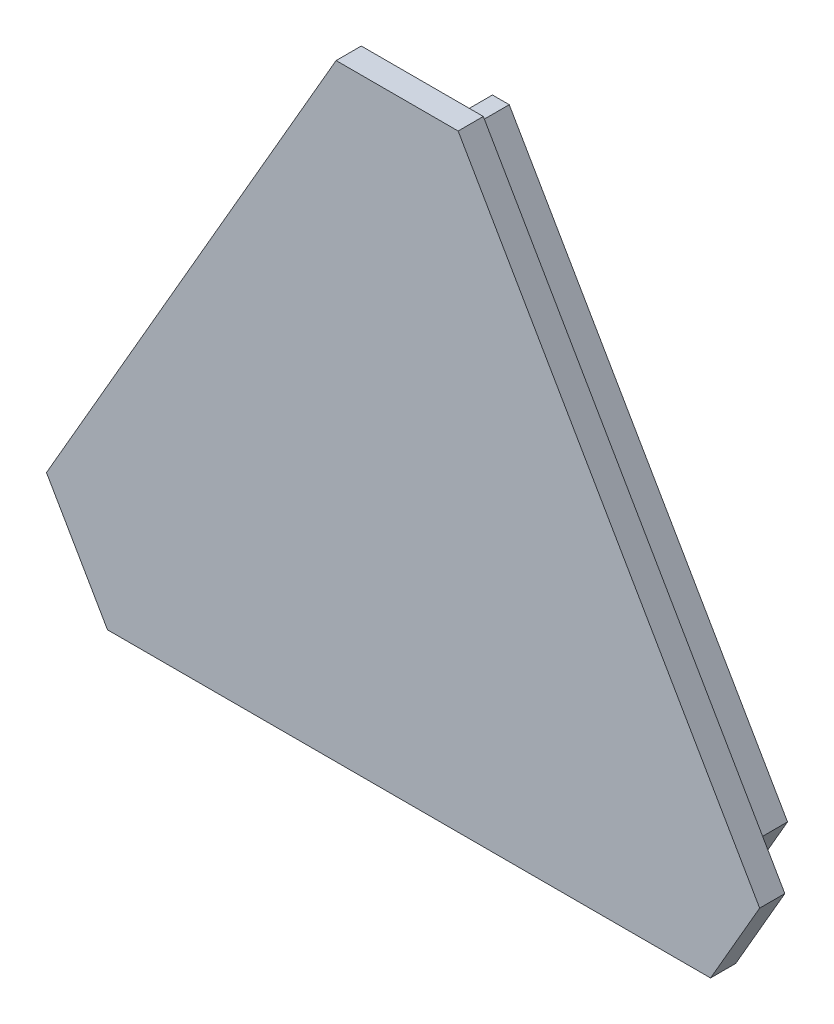
ISO-10303-21;
HEADER;
FILE_DESCRIPTION(('STEP AP214'),'2;1');
FILE_NAME('part.step','',(''),(''),'','','');
FILE_SCHEMA(('AUTOMOTIVE_DESIGN { 1 0 10303 214 1 1 1 1 }'));
ENDSEC;
DATA;
#1=APPLICATION_CONTEXT('core data for automotive mechanical design processes');
#2=APPLICATION_PROTOCOL_DEFINITION('international standard','automotive_design',2000,#1);
#3=PRODUCT_CONTEXT('',#1,'mechanical');
#4=PRODUCT('Part','Part','',(#3));
#5=PRODUCT_RELATED_PRODUCT_CATEGORY('part','',(#4));
#6=PRODUCT_DEFINITION_FORMATION('','',#4);
#7=PRODUCT_DEFINITION_CONTEXT('part definition',#1,'design');
#8=PRODUCT_DEFINITION('design','',#6,#7);
#9=PRODUCT_DEFINITION_SHAPE('','',#8);
#10=(LENGTH_UNIT() NAMED_UNIT(*) SI_UNIT(.MILLI.,.METRE.));
#11=(NAMED_UNIT(*) PLANE_ANGLE_UNIT() SI_UNIT($,.RADIAN.));
#12=(NAMED_UNIT(*) SI_UNIT($,.STERADIAN.) SOLID_ANGLE_UNIT());
#13=UNCERTAINTY_MEASURE_WITH_UNIT(LENGTH_MEASURE(1.E-05),#10,'distance_accuracy_value','');
#14=(GEOMETRIC_REPRESENTATION_CONTEXT(3) GLOBAL_UNCERTAINTY_ASSIGNED_CONTEXT((#13)) GLOBAL_UNIT_ASSIGNED_CONTEXT((#10,
#11,#12)) REPRESENTATION_CONTEXT('',''));
#15=CARTESIAN_POINT('',(0.,0.,0.));
#16=DIRECTION('',(0.,0.,1.));
#17=DIRECTION('',(1.,0.,0.));
#18=AXIS2_PLACEMENT_3D('',#15,#16,#17);
#19=CARTESIAN_POINT('',(77.7690598923241,108.719200876839,-10.));
#20=DIRECTION('',(0.,1.,0.));
#21=DIRECTION('',(0.,0.,1.));
#22=AXIS2_PLACEMENT_3D('',#19,#20,#21);
#23=PLANE('',#22);
#24=DIRECTION('',(-1.,0.,0.));
#25=VECTOR('',#24,1.);
#26=CARTESIAN_POINT('',(77.7690598923241,108.719200876839,0.));
#27=LINE('',#26,#25);
#28=CARTESIAN_POINT('',(77.7690598923241,108.719200876839,0.));
#29=VERTEX_POINT('',#28);
#30=CARTESIAN_POINT('',(74.4315353299548,108.719200876839,0.));
#31=VERTEX_POINT('',#30);
#32=EDGE_CURVE('E142',#29,#31,#27,.T.);
#33=ORIENTED_EDGE('',*,*,#32,.F.);
#34=DIRECTION('',(0.,0.,1.));
#35=VECTOR('',#34,1.);
#36=CARTESIAN_POINT('',(77.7690598923241,108.719200876839,-10.));
#37=LINE('',#36,#35);
#38=CARTESIAN_POINT('',(77.7690598923241,108.719200876839,-10.));
#39=VERTEX_POINT('',#38);
#40=EDGE_CURVE('E11',#39,#29,#37,.T.);
#41=ORIENTED_EDGE('',*,*,#40,.F.);
#42=DIRECTION('',(-1.,0.,0.));
#43=VECTOR('',#42,1.);
#44=CARTESIAN_POINT('',(77.7690598923241,108.719200876839,-10.));
#45=LINE('',#44,#43);
#46=CARTESIAN_POINT('',(74.4315353299548,108.719200876839,-10.));
#47=VERTEX_POINT('',#46);
#48=EDGE_CURVE('E169',#39,#47,#45,.T.);
#49=ORIENTED_EDGE('',*,*,#48,.T.);
#50=DIRECTION('',(0.,0.,1.));
#51=VECTOR('',#50,1.);
#52=CARTESIAN_POINT('',(74.4315353299548,108.719200876839,-10.));
#53=LINE('',#52,#51);
#54=EDGE_CURVE('E36',#47,#31,#53,.T.);
#55=ORIENTED_EDGE('',*,*,#54,.T.);
#56=EDGE_LOOP('',(#33,#41,#49,#55));
#57=FACE_BOUND('',#56,.T.);
#58=ADVANCED_FACE('F33',(#57),#23,.T.);
#59=CARTESIAN_POINT('',(77.7690598923241,108.719200876839,-10.));
#60=DIRECTION('',(0.866025403784439,0.5,0.));
#61=DIRECTION('',(-0.5,0.866025403784439,0.));
#62=AXIS2_PLACEMENT_3D('',#59,#60,#61);
#63=PLANE('',#62);
#64=DIRECTION('',(-0.5,0.866025403784439,0.));
#65=VECTOR('',#64,1.);
#66=CARTESIAN_POINT('',(77.7690598923241,108.719200876839,0.));
#67=LINE('',#66,#65);
#68=CARTESIAN_POINT('',(133.038119784648,12.9903810567665,0.));
#69=VERTEX_POINT('',#68);
#70=EDGE_CURVE('E167',#69,#29,#67,.T.);
#71=ORIENTED_EDGE('',*,*,#70,.F.);
#72=DIRECTION('',(0.,0.,1.));
#73=VECTOR('',#72,1.);
#74=CARTESIAN_POINT('',(133.038119784648,12.9903810567665,-10.));
#75=LINE('',#74,#73);
#76=CARTESIAN_POINT('',(133.038119784648,12.9903810567665,-10.));
#77=VERTEX_POINT('',#76);
#78=EDGE_CURVE('E42',#77,#69,#75,.T.);
#79=ORIENTED_EDGE('',*,*,#78,.F.);
#80=DIRECTION('',(-0.5,0.866025403784439,0.));
#81=VECTOR('',#80,1.);
#82=CARTESIAN_POINT('',(77.7690598923241,108.719200876839,-10.));
#83=LINE('',#82,#81);
#84=EDGE_CURVE('E132',#77,#39,#83,.T.);
#85=ORIENTED_EDGE('',*,*,#84,.T.);
#86=ORIENTED_EDGE('',*,*,#40,.T.);
#87=EDGE_LOOP('',(#71,#79,#85,#86));
#88=FACE_BOUND('',#87,.T.);
#89=ADVANCED_FACE('F186',(#88),#63,.T.);
#90=CARTESIAN_POINT('',(133.038119784648,12.9903810567665,-10.));
#91=DIRECTION('',(0.866025403784438,-0.500000000000001,0.));
#92=DIRECTION('',(0.500000000000001,0.866025403784438,0.));
#93=AXIS2_PLACEMENT_3D('',#90,#91,#92);
#94=PLANE('',#93);
#95=DIRECTION('',(0.500000000000001,0.866025403784438,0.));
#96=VECTOR('',#95,1.);
#97=CARTESIAN_POINT('',(133.038119784648,12.9903810567665,0.));
#98=LINE('',#97,#96);
#99=CARTESIAN_POINT('',(125.769059892324,0.4,0.));
#100=VERTEX_POINT('',#99);
#101=EDGE_CURVE('E119',#100,#69,#98,.T.);
#102=ORIENTED_EDGE('',*,*,#101,.F.);
#103=DIRECTION('',(0.,0.,1.));
#104=VECTOR('',#103,1.);
#105=CARTESIAN_POINT('',(125.769059892324,0.4,-10.));
#106=LINE('',#105,#104);
#107=CARTESIAN_POINT('',(125.769059892324,0.4,-10.));
#108=VERTEX_POINT('',#107);
#109=EDGE_CURVE('E113',#108,#100,#106,.T.);
#110=ORIENTED_EDGE('',*,*,#109,.F.);
#111=DIRECTION('',(0.500000000000001,0.866025403784438,0.));
#112=VECTOR('',#111,1.);
#113=CARTESIAN_POINT('',(133.038119784648,12.9903810567665,-10.));
#114=LINE('',#113,#112);
#115=EDGE_CURVE('E116',#108,#77,#114,.T.);
#116=ORIENTED_EDGE('',*,*,#115,.T.);
#117=ORIENTED_EDGE('',*,*,#78,.T.);
#118=EDGE_LOOP('',(#102,#110,#116,#117));
#119=FACE_BOUND('',#118,.T.);
#120=ADVANCED_FACE('F115',(#119),#94,.T.);
#121=CARTESIAN_POINT('',(125.769059892324,0.4,-10.));
#122=DIRECTION('',(0.,-1.,0.));
#123=DIRECTION('',(1.,0.,0.));
#124=AXIS2_PLACEMENT_3D('',#121,#122,#123);
#125=PLANE('',#124);
#126=DIRECTION('',(1.,0.,0.));
#127=VECTOR('',#126,1.);
#128=CARTESIAN_POINT('',(125.769059892324,0.4,0.));
#129=LINE('',#128,#127);
#130=CARTESIAN_POINT('',(15.2309401076759,0.399999999999986,0.));
#131=VERTEX_POINT('',#130);
#132=EDGE_CURVE('E164',#131,#100,#129,.T.);
#133=ORIENTED_EDGE('',*,*,#132,.F.);
#134=DIRECTION('',(0.,0.,1.));
#135=VECTOR('',#134,1.);
#136=CARTESIAN_POINT('',(15.2309401076759,0.399999999999986,-10.));
#137=LINE('',#136,#135);
#138=CARTESIAN_POINT('',(15.2309401076759,0.399999999999986,-10.));
#139=VERTEX_POINT('',#138);
#140=EDGE_CURVE('E124',#139,#131,#137,.T.);
#141=ORIENTED_EDGE('',*,*,#140,.F.);
#142=DIRECTION('',(1.,0.,0.));
#143=VECTOR('',#142,1.);
#144=CARTESIAN_POINT('',(125.769059892324,0.4,-10.));
#145=LINE('',#144,#143);
#146=EDGE_CURVE('E130',#139,#108,#145,.T.);
#147=ORIENTED_EDGE('',*,*,#146,.T.);
#148=ORIENTED_EDGE('',*,*,#109,.T.);
#149=EDGE_LOOP('',(#133,#141,#147,#148));
#150=FACE_BOUND('',#149,.T.);
#151=ADVANCED_FACE('F134',(#150),#125,.T.);
#152=CARTESIAN_POINT('',(15.2309401076759,0.399999999999986,-10.));
#153=DIRECTION('',(-0.866025403784438,-0.5,0.));
#154=DIRECTION('',(0.500000000000001,-0.866025403784438,0.));
#155=AXIS2_PLACEMENT_3D('',#152,#153,#154);
#156=PLANE('',#155);
#157=DIRECTION('',(0.5,-0.866025403784438,0.));
#158=VECTOR('',#157,1.);
#159=CARTESIAN_POINT('',(15.2309401076759,0.399999999999986,0.));
#160=LINE('',#159,#158);
#161=CARTESIAN_POINT('',(13.5621778264911,3.29038105676649,0.));
#162=VERTEX_POINT('',#161);
#163=EDGE_CURVE('E161',#162,#131,#160,.T.);
#164=ORIENTED_EDGE('',*,*,#163,.F.);
#165=DIRECTION('',(0.,0.,1.));
#166=VECTOR('',#165,1.);
#167=CARTESIAN_POINT('',(13.5621778264911,3.29038105676649,-10.));
#168=LINE('',#167,#166);
#169=CARTESIAN_POINT('',(13.5621778264911,3.29038105676649,-10.));
#170=VERTEX_POINT('',#169);
#171=EDGE_CURVE('E173',#170,#162,#168,.T.);
#172=ORIENTED_EDGE('',*,*,#171,.F.);
#173=DIRECTION('',(0.5,-0.866025403784438,0.));
#174=VECTOR('',#173,1.);
#175=CARTESIAN_POINT('',(15.2309401076759,0.399999999999986,-10.));
#176=LINE('',#175,#174);
#177=EDGE_CURVE('E135',#170,#139,#176,.T.);
#178=ORIENTED_EDGE('',*,*,#177,.T.);
#179=ORIENTED_EDGE('',*,*,#140,.T.);
#180=EDGE_LOOP('',(#164,#172,#178,#179));
#181=FACE_BOUND('',#180,.T.);
#182=ADVANCED_FACE('F199',(#181),#156,.T.);
#183=CARTESIAN_POINT('',(13.5621778264911,3.29038105676649,-10.));
#184=DIRECTION('',(-0.866025403784439,0.5,0.));
#185=DIRECTION('',(-0.5,-0.866025403784439,0.));
#186=AXIS2_PLACEMENT_3D('',#183,#184,#185);
#187=PLANE('',#186);
#188=DIRECTION('',(-0.5,-0.866025403784439,0.));
#189=VECTOR('',#188,1.);
#190=CARTESIAN_POINT('',(13.5621778264911,3.29038105676649,0.));
#191=LINE('',#190,#189);
#192=CARTESIAN_POINT('',(14.7801668912545,5.39999999999999,0.));
#193=VERTEX_POINT('',#192);
#194=EDGE_CURVE('E158',#193,#162,#191,.T.);
#195=ORIENTED_EDGE('',*,*,#194,.F.);
#196=DIRECTION('',(0.,0.,1.));
#197=VECTOR('',#196,1.);
#198=CARTESIAN_POINT('',(14.7801668912545,5.39999999999999,-10.));
#199=LINE('',#198,#197);
#200=CARTESIAN_POINT('',(14.7801668912545,5.39999999999999,-10.));
#201=VERTEX_POINT('',#200);
#202=EDGE_CURVE('E175',#201,#193,#199,.T.);
#203=ORIENTED_EDGE('',*,*,#202,.F.);
#204=DIRECTION('',(-0.5,-0.866025403784439,0.));
#205=VECTOR('',#204,1.);
#206=CARTESIAN_POINT('',(13.5621778264911,3.29038105676649,-10.));
#207=LINE('',#206,#205);
#208=EDGE_CURVE('E137',#201,#170,#207,.T.);
#209=ORIENTED_EDGE('',*,*,#208,.T.);
#210=ORIENTED_EDGE('',*,*,#171,.T.);
#211=EDGE_LOOP('',(#195,#203,#209,#210));
#212=FACE_BOUND('',#211,.T.);
#213=ADVANCED_FACE('F202',(#212),#187,.T.);
#214=CARTESIAN_POINT('',(14.7801668912545,5.39999999999999,-10.));
#215=DIRECTION('',(0.,1.,0.));
#216=DIRECTION('',(0.,0.,1.));
#217=AXIS2_PLACEMENT_3D('',#214,#215,#216);
#218=PLANE('',#217);
#219=DIRECTION('',(-1.,0.,0.));
#220=VECTOR('',#219,1.);
#221=CARTESIAN_POINT('',(14.7801668912545,5.39999999999999,0.));
#222=LINE('',#221,#220);
#223=CARTESIAN_POINT('',(122.882308546376,5.39999999999999,0.));
#224=VERTEX_POINT('',#223);
#225=EDGE_CURVE('E155',#224,#193,#222,.T.);
#226=ORIENTED_EDGE('',*,*,#225,.F.);
#227=DIRECTION('',(0.,0.,1.));
#228=VECTOR('',#227,1.);
#229=CARTESIAN_POINT('',(122.882308546376,5.39999999999999,-10.));
#230=LINE('',#229,#228);
#231=CARTESIAN_POINT('',(122.882308546376,5.39999999999999,-10.));
#232=VERTEX_POINT('',#231);
#233=EDGE_CURVE('E177',#232,#224,#230,.T.);
#234=ORIENTED_EDGE('',*,*,#233,.F.);
#235=DIRECTION('',(-1.,0.,0.));
#236=VECTOR('',#235,1.);
#237=CARTESIAN_POINT('',(14.7801668912545,5.39999999999999,-10.));
#238=LINE('',#237,#236);
#239=EDGE_CURVE('E301',#232,#201,#238,.T.);
#240=ORIENTED_EDGE('',*,*,#239,.T.);
#241=ORIENTED_EDGE('',*,*,#202,.T.);
#242=EDGE_LOOP('',(#226,#234,#240,#241));
#243=FACE_BOUND('',#242,.T.);
#244=ADVANCED_FACE('F206',(#243),#218,.T.);
#245=CARTESIAN_POINT('',(122.882308546376,5.39999999999999,-10.));
#246=DIRECTION('',(-0.866025403784439,0.499999999999999,0.));
#247=DIRECTION('',(-0.499999999999999,-0.866025403784439,0.));
#248=AXIS2_PLACEMENT_3D('',#245,#246,#247);
#249=PLANE('',#248);
#250=DIRECTION('',(-0.499999999999999,-0.866025403784439,0.));
#251=VECTOR('',#250,1.);
#252=CARTESIAN_POINT('',(122.882308546376,5.39999999999999,0.));
#253=LINE('',#252,#251);
#254=CARTESIAN_POINT('',(127.264617092752,12.9903810567665,0.));
#255=VERTEX_POINT('',#254);
#256=EDGE_CURVE('E152',#255,#224,#253,.T.);
#257=ORIENTED_EDGE('',*,*,#256,.F.);
#258=DIRECTION('',(0.,0.,1.));
#259=VECTOR('',#258,1.);
#260=CARTESIAN_POINT('',(127.264617092752,12.9903810567665,-10.));
#261=LINE('',#260,#259);
#262=CARTESIAN_POINT('',(127.264617092752,12.9903810567665,-10.));
#263=VERTEX_POINT('',#262);
#264=EDGE_CURVE('E179',#263,#255,#261,.T.);
#265=ORIENTED_EDGE('',*,*,#264,.F.);
#266=DIRECTION('',(-0.499999999999999,-0.866025403784439,0.));
#267=VECTOR('',#266,1.);
#268=CARTESIAN_POINT('',(122.882308546376,5.39999999999999,-10.));
#269=LINE('',#268,#267);
#270=EDGE_CURVE('E298',#263,#232,#269,.T.);
#271=ORIENTED_EDGE('',*,*,#270,.T.);
#272=ORIENTED_EDGE('',*,*,#233,.T.);
#273=EDGE_LOOP('',(#257,#265,#271,#272));
#274=FACE_BOUND('',#273,.T.);
#275=ADVANCED_FACE('F210',(#274),#249,.T.);
#276=CARTESIAN_POINT('',(127.264617092752,12.9903810567665,-10.));
#277=DIRECTION('',(-0.866025403784439,-0.5,0.));
#278=DIRECTION('',(0.5,-0.866025403784439,0.));
#279=AXIS2_PLACEMENT_3D('',#276,#277,#278);
#280=PLANE('',#279);
#281=DIRECTION('',(0.5,-0.866025403784438,0.));
#282=VECTOR('',#281,1.);
#283=CARTESIAN_POINT('',(127.264617092752,12.9903810567665,0.));
#284=LINE('',#283,#282);
#285=CARTESIAN_POINT('',(73.2135462651913,106.609581933606,0.));
#286=VERTEX_POINT('',#285);
#287=EDGE_CURVE('E149',#286,#255,#284,.T.);
#288=ORIENTED_EDGE('',*,*,#287,.F.);
#289=DIRECTION('',(0.,0.,1.));
#290=VECTOR('',#289,1.);
#291=CARTESIAN_POINT('',(73.2135462651913,106.609581933606,-10.));
#292=LINE('',#291,#290);
#293=CARTESIAN_POINT('',(73.2135462651913,106.609581933606,-10.));
#294=VERTEX_POINT('',#293);
#295=EDGE_CURVE('E180',#294,#286,#292,.T.);
#296=ORIENTED_EDGE('',*,*,#295,.F.);
#297=DIRECTION('',(0.5,-0.866025403784438,0.));
#298=VECTOR('',#297,1.);
#299=CARTESIAN_POINT('',(127.264617092752,12.9903810567665,-10.));
#300=LINE('',#299,#298);
#301=EDGE_CURVE('E295',#294,#263,#300,.T.);
#302=ORIENTED_EDGE('',*,*,#301,.T.);
#303=ORIENTED_EDGE('',*,*,#264,.T.);
#304=EDGE_LOOP('',(#288,#296,#302,#303));
#305=FACE_BOUND('',#304,.T.);
#306=ADVANCED_FACE('F214',(#305),#280,.T.);
#307=CARTESIAN_POINT('',(74.4315353299548,108.719200876839,-10.));
#308=DIRECTION('',(-0.866025403784438,0.5,0.));
#309=DIRECTION('',(-0.5,-0.866025403784439,0.));
#310=AXIS2_PLACEMENT_3D('',#307,#308,#309);
#311=PLANE('',#310);
#312=DIRECTION('',(-0.5,-0.866025403784439,0.));
#313=VECTOR('',#312,1.);
#314=CARTESIAN_POINT('',(74.4315353299548,108.719200876839,0.));
#315=LINE('',#314,#313);
#316=EDGE_CURVE('E145',#31,#286,#315,.T.);
#317=ORIENTED_EDGE('',*,*,#316,.F.);
#318=ORIENTED_EDGE('',*,*,#54,.F.);
#319=DIRECTION('',(-0.5,-0.866025403784439,0.));
#320=VECTOR('',#319,1.);
#321=CARTESIAN_POINT('',(74.4315353299548,108.719200876839,-10.));
#322=LINE('',#321,#320);
#323=EDGE_CURVE('E293',#47,#294,#322,.T.);
#324=ORIENTED_EDGE('',*,*,#323,.T.);
#325=ORIENTED_EDGE('',*,*,#295,.T.);
#326=EDGE_LOOP('',(#317,#318,#324,#325));
#327=FACE_BOUND('',#326,.T.);
#328=ADVANCED_FACE('F182',(#327),#311,.T.);
#329=CARTESIAN_POINT('',(74.4315353299548,108.719200876839,-10.));
#330=DIRECTION('',(0.,0.,1.));
#331=DIRECTION('',(1.,0.,0.));
#332=AXIS2_PLACEMENT_3D('',#329,#330,#331);
#333=PLANE('',#332);
#334=ORIENTED_EDGE('',*,*,#48,.F.);
#335=ORIENTED_EDGE('',*,*,#84,.F.);
#336=ORIENTED_EDGE('',*,*,#115,.F.);
#337=ORIENTED_EDGE('',*,*,#146,.F.);
#338=ORIENTED_EDGE('',*,*,#177,.F.);
#339=ORIENTED_EDGE('',*,*,#208,.F.);
#340=ORIENTED_EDGE('',*,*,#239,.F.);
#341=ORIENTED_EDGE('',*,*,#270,.F.);
#342=ORIENTED_EDGE('',*,*,#301,.F.);
#343=ORIENTED_EDGE('',*,*,#323,.F.);
#344=EDGE_LOOP('',(#334,#335,#336,#337,#338,#339,#340,#341,#342,#343));
#345=FACE_BOUND('',#344,.T.);
#346=ADVANCED_FACE('F128',(#345),#333,.F.);
#347=CARTESIAN_POINT('',(0.86047190431933,14.4903810567665,5.));
#348=DIRECTION('',(0.866025403784439,-0.5,0.));
#349=DIRECTION('',(0.5,0.866025403784439,0.));
#350=AXIS2_PLACEMENT_3D('',#347,#348,#349);
#351=PLANE('',#350);
#352=DIRECTION('',(-0.5,-0.866025403784439,0.));
#353=VECTOR('',#352,1.);
#354=CARTESIAN_POINT('',(0.86047190431933,14.4903810567665,0.));
#355=LINE('',#354,#353);
#356=CARTESIAN_POINT('',(58.381197846483,114.119200876839,0.));
#357=VERTEX_POINT('',#356);
#358=CARTESIAN_POINT('',(0.86047190431933,14.4903810567665,0.));
#359=VERTEX_POINT('',#358);
#360=EDGE_CURVE('E283',#357,#359,#355,.T.);
#361=ORIENTED_EDGE('',*,*,#360,.T.);
#362=DIRECTION('',(0.,0.,-1.));
#363=VECTOR('',#362,1.);
#364=CARTESIAN_POINT('',(0.86047190431933,14.4903810567665,5.));
#365=LINE('',#364,#363);
#366=CARTESIAN_POINT('',(0.86047190431933,14.4903810567665,5.));
#367=VERTEX_POINT('',#366);
#368=EDGE_CURVE('E146',#367,#359,#365,.T.);
#369=ORIENTED_EDGE('',*,*,#368,.F.);
#370=DIRECTION('',(-0.5,-0.866025403784439,0.));
#371=VECTOR('',#370,1.);
#372=CARTESIAN_POINT('',(0.86047190431933,14.4903810567665,5.));
#373=LINE('',#372,#371);
#374=CARTESIAN_POINT('',(58.381197846483,114.119200876839,5.));
#375=VERTEX_POINT('',#374);
#376=EDGE_CURVE('E263',#375,#367,#373,.T.);
#377=ORIENTED_EDGE('',*,*,#376,.F.);
#378=DIRECTION('',(0.,0.,-1.));
#379=VECTOR('',#378,1.);
#380=CARTESIAN_POINT('',(58.381197846483,114.119200876839,5.));
#381=LINE('',#380,#379);
#382=EDGE_CURVE('E334',#375,#357,#381,.T.);
#383=ORIENTED_EDGE('',*,*,#382,.T.);
#384=EDGE_LOOP('',(#361,#369,#377,#383));
#385=FACE_BOUND('',#384,.T.);
#386=ADVANCED_FACE('F222',(#385),#351,.F.);
#387=CARTESIAN_POINT('',(12.9792740578363,-6.5,5.));
#388=DIRECTION('',(0.866025403784439,0.5,0.));
#389=DIRECTION('',(-0.5,0.866025403784439,0.));
#390=AXIS2_PLACEMENT_3D('',#387,#388,#389);
#391=PLANE('',#390);
#392=DIRECTION('',(0.5,-0.866025403784438,0.));
#393=VECTOR('',#392,1.);
#394=CARTESIAN_POINT('',(12.9792740578363,-6.5,0.));
#395=LINE('',#394,#393);
#396=CARTESIAN_POINT('',(12.9792740578363,-6.5,0.));
#397=VERTEX_POINT('',#396);
#398=EDGE_CURVE('E342',#359,#397,#395,.T.);
#399=ORIENTED_EDGE('',*,*,#398,.T.);
#400=DIRECTION('',(0.,0.,-1.));
#401=VECTOR('',#400,1.);
#402=CARTESIAN_POINT('',(12.9792740578363,-6.5,5.));
#403=LINE('',#402,#401);
#404=CARTESIAN_POINT('',(12.9792740578363,-6.5,5.));
#405=VERTEX_POINT('',#404);
#406=EDGE_CURVE('E285',#405,#397,#403,.T.);
#407=ORIENTED_EDGE('',*,*,#406,.F.);
#408=DIRECTION('',(0.5,-0.866025403784438,0.));
#409=VECTOR('',#408,1.);
#410=CARTESIAN_POINT('',(12.9792740578363,-6.5,5.));
#411=LINE('',#410,#409);
#412=EDGE_CURVE('E268',#367,#405,#411,.T.);
#413=ORIENTED_EDGE('',*,*,#412,.F.);
#414=ORIENTED_EDGE('',*,*,#368,.T.);
#415=EDGE_LOOP('',(#399,#407,#413,#414));
#416=FACE_BOUND('',#415,.T.);
#417=ADVANCED_FACE('F226',(#416),#391,.F.);
#418=CARTESIAN_POINT('',(132.75,-6.5,5.));
#419=DIRECTION('',(0.,1.,0.));
#420=DIRECTION('',(0.,0.,1.));
#421=AXIS2_PLACEMENT_3D('',#418,#419,#420);
#422=PLANE('',#421);
#423=DIRECTION('',(1.,0.,0.));
#424=VECTOR('',#423,1.);
#425=CARTESIAN_POINT('',(132.75,-6.5,0.));
#426=LINE('',#425,#424);
#427=CARTESIAN_POINT('',(132.75,-6.5,0.));
#428=VERTEX_POINT('',#427);
#429=EDGE_CURVE('E344',#397,#428,#426,.T.);
#430=ORIENTED_EDGE('',*,*,#429,.T.);
#431=DIRECTION('',(0.,0.,-1.));
#432=VECTOR('',#431,1.);
#433=CARTESIAN_POINT('',(132.75,-6.5,5.));
#434=LINE('',#433,#432);
#435=CARTESIAN_POINT('',(132.75,-6.5,5.));
#436=VERTEX_POINT('',#435);
#437=EDGE_CURVE('E288',#436,#428,#434,.T.);
#438=ORIENTED_EDGE('',*,*,#437,.F.);
#439=DIRECTION('',(1.,0.,0.));
#440=VECTOR('',#439,1.);
#441=CARTESIAN_POINT('',(132.75,-6.5,5.));
#442=LINE('',#441,#440);
#443=EDGE_CURVE('E369',#405,#436,#442,.T.);
#444=ORIENTED_EDGE('',*,*,#443,.F.);
#445=ORIENTED_EDGE('',*,*,#406,.T.);
#446=EDGE_LOOP('',(#430,#438,#444,#445));
#447=FACE_BOUND('',#446,.T.);
#448=ADVANCED_FACE('F231',(#447),#422,.F.);
#449=CARTESIAN_POINT('',(142.504165124599,10.3947095812217,5.));
#450=DIRECTION('',(-0.866025403784439,0.5,0.));
#451=DIRECTION('',(-0.5,-0.866025403784439,0.));
#452=AXIS2_PLACEMENT_3D('',#449,#450,#451);
#453=PLANE('',#452);
#454=DIRECTION('',(0.5,0.866025403784439,0.));
#455=VECTOR('',#454,1.);
#456=CARTESIAN_POINT('',(142.504165124599,10.3947095812217,0.));
#457=LINE('',#456,#455);
#458=CARTESIAN_POINT('',(142.504165124599,10.3947095812217,0.));
#459=VERTEX_POINT('',#458);
#460=EDGE_CURVE('E350',#428,#459,#457,.T.);
#461=ORIENTED_EDGE('',*,*,#460,.T.);
#462=DIRECTION('',(0.,0.,-1.));
#463=VECTOR('',#462,1.);
#464=CARTESIAN_POINT('',(142.504165124599,10.3947095812217,5.));
#465=LINE('',#464,#463);
#466=CARTESIAN_POINT('',(142.504165124599,10.3947095812217,5.));
#467=VERTEX_POINT('',#466);
#468=EDGE_CURVE('E354',#467,#459,#465,.T.);
#469=ORIENTED_EDGE('',*,*,#468,.F.);
#470=DIRECTION('',(0.5,0.866025403784439,0.));
#471=VECTOR('',#470,1.);
#472=CARTESIAN_POINT('',(142.504165124599,10.3947095812217,5.));
#473=LINE('',#472,#471);
#474=EDGE_CURVE('E363',#436,#467,#473,.T.);
#475=ORIENTED_EDGE('',*,*,#474,.F.);
#476=ORIENTED_EDGE('',*,*,#437,.T.);
#477=EDGE_LOOP('',(#461,#469,#475,#476));
#478=FACE_BOUND('',#477,.T.);
#479=ADVANCED_FACE('F238',(#478),#453,.F.);
#480=CARTESIAN_POINT('',(82.618802153517,114.119200876839,5.));
#481=DIRECTION('',(-0.866025403784438,-0.5,0.));
#482=DIRECTION('',(0.5,-0.866025403784438,0.));
#483=AXIS2_PLACEMENT_3D('',#480,#481,#482);
#484=PLANE('',#483);
#485=DIRECTION('',(-0.5,0.866025403784438,0.));
#486=VECTOR('',#485,1.);
#487=CARTESIAN_POINT('',(82.618802153517,114.119200876839,0.));
#488=LINE('',#487,#486);
#489=CARTESIAN_POINT('',(82.618802153517,114.119200876839,0.));
#490=VERTEX_POINT('',#489);
#491=EDGE_CURVE('E338',#459,#490,#488,.T.);
#492=ORIENTED_EDGE('',*,*,#491,.T.);
#493=DIRECTION('',(0.,0.,-1.));
#494=VECTOR('',#493,1.);
#495=CARTESIAN_POINT('',(82.618802153517,114.119200876839,5.));
#496=LINE('',#495,#494);
#497=CARTESIAN_POINT('',(82.618802153517,114.119200876839,5.));
#498=VERTEX_POINT('',#497);
#499=EDGE_CURVE('E336',#498,#490,#496,.T.);
#500=ORIENTED_EDGE('',*,*,#499,.F.);
#501=DIRECTION('',(-0.5,0.866025403784438,0.));
#502=VECTOR('',#501,1.);
#503=CARTESIAN_POINT('',(82.618802153517,114.119200876839,5.));
#504=LINE('',#503,#502);
#505=EDGE_CURVE('E366',#467,#498,#504,.T.);
#506=ORIENTED_EDGE('',*,*,#505,.F.);
#507=ORIENTED_EDGE('',*,*,#468,.T.);
#508=EDGE_LOOP('',(#492,#500,#506,#507));
#509=FACE_BOUND('',#508,.T.);
#510=ADVANCED_FACE('F242',(#509),#484,.F.);
#511=CARTESIAN_POINT('',(58.381197846483,114.119200876839,5.));
#512=DIRECTION('',(0.,-1.,0.));
#513=DIRECTION('',(0.,0.,-1.));
#514=AXIS2_PLACEMENT_3D('',#511,#512,#513);
#515=PLANE('',#514);
#516=DIRECTION('',(-1.,0.,0.));
#517=VECTOR('',#516,1.);
#518=CARTESIAN_POINT('',(58.381197846483,114.119200876839,0.));
#519=LINE('',#518,#517);
#520=EDGE_CURVE('E278',#490,#357,#519,.T.);
#521=ORIENTED_EDGE('',*,*,#520,.T.);
#522=ORIENTED_EDGE('',*,*,#382,.F.);
#523=DIRECTION('',(-1.,0.,0.));
#524=VECTOR('',#523,1.);
#525=CARTESIAN_POINT('',(58.381197846483,114.119200876839,5.));
#526=LINE('',#525,#524);
#527=EDGE_CURVE('E273',#498,#375,#526,.T.);
#528=ORIENTED_EDGE('',*,*,#527,.F.);
#529=ORIENTED_EDGE('',*,*,#499,.T.);
#530=EDGE_LOOP('',(#521,#522,#528,#529));
#531=FACE_BOUND('',#530,.T.);
#532=ADVANCED_FACE('F246',(#531),#515,.F.);
#533=CARTESIAN_POINT('',(58.381197846483,114.119200876839,5.));
#534=DIRECTION('',(0.,0.,-1.));
#535=DIRECTION('',(-1.,0.,0.));
#536=AXIS2_PLACEMENT_3D('',#533,#534,#535);
#537=PLANE('',#536);
#538=ORIENTED_EDGE('',*,*,#376,.T.);
#539=ORIENTED_EDGE('',*,*,#412,.T.);
#540=ORIENTED_EDGE('',*,*,#443,.T.);
#541=ORIENTED_EDGE('',*,*,#474,.T.);
#542=ORIENTED_EDGE('',*,*,#505,.T.);
#543=ORIENTED_EDGE('',*,*,#527,.T.);
#544=EDGE_LOOP('',(#538,#539,#540,#541,#542,#543));
#545=FACE_BOUND('',#544,.T.);
#546=ADVANCED_FACE('F250',(#545),#537,.F.);
#547=CARTESIAN_POINT('',(58.381197846483,114.119200876839,0.));
#548=DIRECTION('',(0.,0.,-1.));
#549=DIRECTION('',(-1.,0.,0.));
#550=AXIS2_PLACEMENT_3D('',#547,#548,#549);
#551=PLANE('',#550);
#552=ORIENTED_EDGE('',*,*,#70,.T.);
#553=ORIENTED_EDGE('',*,*,#32,.T.);
#554=ORIENTED_EDGE('',*,*,#316,.T.);
#555=ORIENTED_EDGE('',*,*,#287,.T.);
#556=ORIENTED_EDGE('',*,*,#256,.T.);
#557=ORIENTED_EDGE('',*,*,#225,.T.);
#558=ORIENTED_EDGE('',*,*,#194,.T.);
#559=ORIENTED_EDGE('',*,*,#163,.T.);
#560=ORIENTED_EDGE('',*,*,#132,.T.);
#561=ORIENTED_EDGE('',*,*,#101,.T.);
#562=EDGE_LOOP('',(#552,#553,#554,#555,#556,#557,#558,#559,#560,#561));
#563=FACE_BOUND('',#562,.T.);
#564=ORIENTED_EDGE('',*,*,#360,.F.);
#565=ORIENTED_EDGE('',*,*,#520,.F.);
#566=ORIENTED_EDGE('',*,*,#491,.F.);
#567=ORIENTED_EDGE('',*,*,#460,.F.);
#568=ORIENTED_EDGE('',*,*,#429,.F.);
#569=ORIENTED_EDGE('',*,*,#398,.F.);
#570=EDGE_LOOP('',(#564,#565,#566,#567,#568,#569));
#571=FACE_BOUND('',#570,.T.);
#572=ADVANCED_FACE('F184',(#563,#571),#551,.T.);
#573=CLOSED_SHELL('',(#58,#89,#120,#151,#182,#213,#244,#275,#306,#328,#346,#386,#417,#448,#479,
#510,#532,#546,#572));
#574=MANIFOLD_SOLID_BREP('B2',#573);
#575=ADVANCED_BREP_SHAPE_REPRESENTATION('',(#18,#574),#14);
#576=SHAPE_DEFINITION_REPRESENTATION(#9,#575);
ENDSEC;
END-ISO-10303-21;
